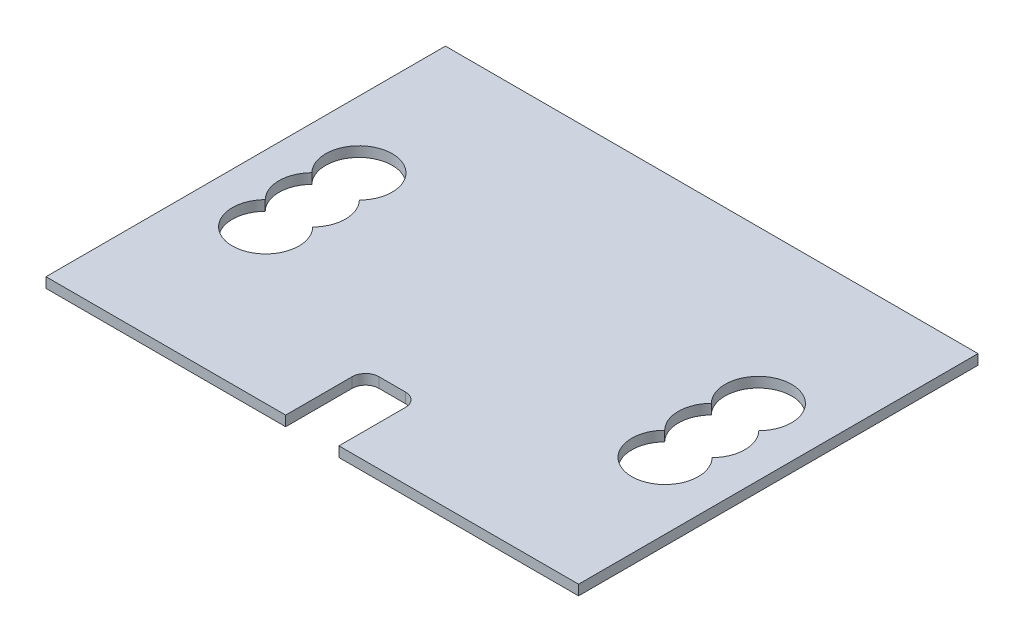
ISO-10303-21;
HEADER;
FILE_DESCRIPTION(('STEP AP214'),'2;1');
FILE_NAME('part.step','',(''),(''),'','','');
FILE_SCHEMA(('AUTOMOTIVE_DESIGN { 1 0 10303 214 1 1 1 1 }'));
ENDSEC;
DATA;
#1=APPLICATION_CONTEXT('core data for automotive mechanical design processes');
#2=APPLICATION_PROTOCOL_DEFINITION('international standard','automotive_design',2000,#1);
#3=PRODUCT_CONTEXT('',#1,'mechanical');
#4=PRODUCT('Part','Part','',(#3));
#5=PRODUCT_RELATED_PRODUCT_CATEGORY('part','',(#4));
#6=PRODUCT_DEFINITION_FORMATION('','',#4);
#7=PRODUCT_DEFINITION_CONTEXT('part definition',#1,'design');
#8=PRODUCT_DEFINITION('design','',#6,#7);
#9=PRODUCT_DEFINITION_SHAPE('','',#8);
#10=(LENGTH_UNIT() NAMED_UNIT(*) SI_UNIT(.MILLI.,.METRE.));
#11=(NAMED_UNIT(*) PLANE_ANGLE_UNIT() SI_UNIT($,.RADIAN.));
#12=(NAMED_UNIT(*) SI_UNIT($,.STERADIAN.) SOLID_ANGLE_UNIT());
#13=UNCERTAINTY_MEASURE_WITH_UNIT(LENGTH_MEASURE(1.E-05),#10,'distance_accuracy_value','');
#14=(GEOMETRIC_REPRESENTATION_CONTEXT(3) GLOBAL_UNCERTAINTY_ASSIGNED_CONTEXT((#13)) GLOBAL_UNIT_ASSIGNED_CONTEXT((#10,
#11,#12)) REPRESENTATION_CONTEXT('',''));
#15=CARTESIAN_POINT('',(0.,0.,0.));
#16=DIRECTION('',(0.,0.,1.));
#17=DIRECTION('',(1.,0.,0.));
#18=AXIS2_PLACEMENT_3D('',#15,#16,#17);
#19=CARTESIAN_POINT('',(0.,7.62,0.));
#20=DIRECTION('',(0.,0.,-1.));
#21=DIRECTION('',(-1.,0.,0.));
#22=AXIS2_PLACEMENT_3D('',#19,#20,#21);
#23=PLANE('',#22);
#24=DIRECTION('',(1.,0.,0.));
#25=VECTOR('',#24,1.);
#26=CARTESIAN_POINT('',(0.,0.,0.));
#27=LINE('',#26,#25);
#28=CARTESIAN_POINT('',(0.,0.,0.));
#29=VERTEX_POINT('',#28);
#30=CARTESIAN_POINT('',(180.,0.,0.));
#31=VERTEX_POINT('',#30);
#32=EDGE_CURVE('E175',#29,#31,#27,.T.);
#33=ORIENTED_EDGE('',*,*,#32,.T.);
#34=DIRECTION('',(0.,1.,0.));
#35=VECTOR('',#34,1.);
#36=CARTESIAN_POINT('',(180.,0.,0.));
#37=LINE('',#36,#35);
#38=CARTESIAN_POINT('',(180.,7.62,0.));
#39=VERTEX_POINT('',#38);
#40=EDGE_CURVE('E158',#31,#39,#37,.T.);
#41=ORIENTED_EDGE('',*,*,#40,.T.);
#42=DIRECTION('',(1.,0.,0.));
#43=VECTOR('',#42,1.);
#44=CARTESIAN_POINT('',(0.,7.62,0.));
#45=LINE('',#44,#43);
#46=CARTESIAN_POINT('',(0.,7.62,0.));
#47=VERTEX_POINT('',#46);
#48=EDGE_CURVE('E223',#47,#39,#45,.T.);
#49=ORIENTED_EDGE('',*,*,#48,.F.);
#50=DIRECTION('',(0.,-1.,0.));
#51=VECTOR('',#50,1.);
#52=CARTESIAN_POINT('',(0.,7.62,0.));
#53=LINE('',#52,#51);
#54=EDGE_CURVE('E11',#47,#29,#53,.T.);
#55=ORIENTED_EDGE('',*,*,#54,.T.);
#56=EDGE_LOOP('',(#33,#41,#49,#55));
#57=FACE_BOUND('',#56,.T.);
#58=ADVANCED_FACE('F33',(#57),#23,.F.);
#59=CARTESIAN_POINT('',(0.,7.62,0.));
#60=DIRECTION('',(1.,0.,0.));
#61=DIRECTION('',(0.,0.,-1.));
#62=AXIS2_PLACEMENT_3D('',#59,#60,#61);
#63=PLANE('',#62);
#64=DIRECTION('',(0.,0.,1.));
#65=VECTOR('',#64,1.);
#66=CARTESIAN_POINT('',(0.,0.,0.));
#67=LINE('',#66,#65);
#68=CARTESIAN_POINT('',(0.,0.,-300.));
#69=VERTEX_POINT('',#68);
#70=EDGE_CURVE('E188',#69,#29,#67,.T.);
#71=ORIENTED_EDGE('',*,*,#70,.T.);
#72=ORIENTED_EDGE('',*,*,#54,.F.);
#73=DIRECTION('',(0.,0.,1.));
#74=VECTOR('',#73,1.);
#75=CARTESIAN_POINT('',(0.,7.62,0.));
#76=LINE('',#75,#74);
#77=CARTESIAN_POINT('',(0.,7.62,-300.));
#78=VERTEX_POINT('',#77);
#79=EDGE_CURVE('E193',#78,#47,#76,.T.);
#80=ORIENTED_EDGE('',*,*,#79,.F.);
#81=DIRECTION('',(0.,-1.,0.));
#82=VECTOR('',#81,1.);
#83=CARTESIAN_POINT('',(0.,7.62,-300.));
#84=LINE('',#83,#82);
#85=EDGE_CURVE('E194',#78,#69,#84,.T.);
#86=ORIENTED_EDGE('',*,*,#85,.T.);
#87=EDGE_LOOP('',(#71,#72,#80,#86));
#88=FACE_BOUND('',#87,.T.);
#89=ADVANCED_FACE('F35',(#88),#63,.F.);
#90=CARTESIAN_POINT('',(220.,7.62,0.));
#91=VERTEX_POINT('',#90);
#92=CARTESIAN_POINT('',(400.,7.62,0.));
#93=VERTEX_POINT('',#92);
#94=EDGE_CURVE('E221',#91,#93,#45,.T.);
#95=ORIENTED_EDGE('',*,*,#94,.F.);
#96=DIRECTION('',(0.,1.,0.));
#97=VECTOR('',#96,1.);
#98=CARTESIAN_POINT('',(220.,0.,0.));
#99=LINE('',#98,#97);
#100=CARTESIAN_POINT('',(220.,0.,0.));
#101=VERTEX_POINT('',#100);
#102=EDGE_CURVE('E168',#101,#91,#99,.T.);
#103=ORIENTED_EDGE('',*,*,#102,.F.);
#104=CARTESIAN_POINT('',(400.,0.,0.));
#105=VERTEX_POINT('',#104);
#106=EDGE_CURVE('E184',#101,#105,#27,.T.);
#107=ORIENTED_EDGE('',*,*,#106,.T.);
#108=DIRECTION('',(0.,-1.,0.));
#109=VECTOR('',#108,1.);
#110=CARTESIAN_POINT('',(400.,7.62,0.));
#111=LINE('',#110,#109);
#112=EDGE_CURVE('E41',#93,#105,#111,.T.);
#113=ORIENTED_EDGE('',*,*,#112,.F.);
#114=EDGE_LOOP('',(#95,#103,#107,#113));
#115=FACE_BOUND('',#114,.T.);
#116=ADVANCED_FACE('F235',(#115),#23,.F.);
#117=CARTESIAN_POINT('',(400.,7.62,0.));
#118=DIRECTION('',(-1.,0.,0.));
#119=DIRECTION('',(0.,0.,1.));
#120=AXIS2_PLACEMENT_3D('',#117,#118,#119);
#121=PLANE('',#120);
#122=DIRECTION('',(0.,0.,-1.));
#123=VECTOR('',#122,1.);
#124=CARTESIAN_POINT('',(400.,0.,0.));
#125=LINE('',#124,#123);
#126=CARTESIAN_POINT('',(400.,0.,-300.));
#127=VERTEX_POINT('',#126);
#128=EDGE_CURVE('E183',#105,#127,#125,.T.);
#129=ORIENTED_EDGE('',*,*,#128,.T.);
#130=DIRECTION('',(0.,-1.,0.));
#131=VECTOR('',#130,1.);
#132=CARTESIAN_POINT('',(400.,7.62,-300.));
#133=LINE('',#132,#131);
#134=CARTESIAN_POINT('',(400.,7.62,-300.));
#135=VERTEX_POINT('',#134);
#136=EDGE_CURVE('E197',#135,#127,#133,.T.);
#137=ORIENTED_EDGE('',*,*,#136,.F.);
#138=DIRECTION('',(0.,0.,-1.));
#139=VECTOR('',#138,1.);
#140=CARTESIAN_POINT('',(400.,7.62,0.));
#141=LINE('',#140,#139);
#142=EDGE_CURVE('E207',#93,#135,#141,.T.);
#143=ORIENTED_EDGE('',*,*,#142,.F.);
#144=ORIENTED_EDGE('',*,*,#112,.T.);
#145=EDGE_LOOP('',(#129,#137,#143,#144));
#146=FACE_BOUND('',#145,.T.);
#147=ADVANCED_FACE('F205',(#146),#121,.F.);
#148=CARTESIAN_POINT('',(0.,7.62,-300.));
#149=DIRECTION('',(0.,0.,1.));
#150=DIRECTION('',(1.,0.,0.));
#151=AXIS2_PLACEMENT_3D('',#148,#149,#150);
#152=PLANE('',#151);
#153=DIRECTION('',(-1.,0.,0.));
#154=VECTOR('',#153,1.);
#155=CARTESIAN_POINT('',(0.,0.,-300.));
#156=LINE('',#155,#154);
#157=EDGE_CURVE('E186',#127,#69,#156,.T.);
#158=ORIENTED_EDGE('',*,*,#157,.T.);
#159=ORIENTED_EDGE('',*,*,#85,.F.);
#160=DIRECTION('',(-1.,0.,0.));
#161=VECTOR('',#160,1.);
#162=CARTESIAN_POINT('',(0.,7.62,-300.));
#163=LINE('',#162,#161);
#164=EDGE_CURVE('E198',#135,#78,#163,.T.);
#165=ORIENTED_EDGE('',*,*,#164,.F.);
#166=ORIENTED_EDGE('',*,*,#136,.T.);
#167=EDGE_LOOP('',(#158,#159,#165,#166));
#168=FACE_BOUND('',#167,.T.);
#169=ADVANCED_FACE('F215',(#168),#152,.F.);
#170=CARTESIAN_POINT('',(0.,7.62,0.));
#171=DIRECTION('',(0.,-1.,0.));
#172=DIRECTION('',(0.,0.,-1.));
#173=AXIS2_PLACEMENT_3D('',#170,#171,#172);
#174=PLANE('',#173);
#175=CARTESIAN_POINT('',(50.,7.62,-150.));
#176=DIRECTION('',(0.,1.,0.));
#177=DIRECTION('',(0.,0.,1.));
#178=AXIS2_PLACEMENT_3D('',#175,#176,#177);
#179=CIRCLE('',#178,25.);
#180=CARTESIAN_POINT('',(67.8280487995744,7.62,-132.474));
#181=VERTEX_POINT('',#180);
#182=CARTESIAN_POINT('',(67.8280487995742,7.62,-167.526));
#183=VERTEX_POINT('',#182);
#184=EDGE_CURVE('E258',#181,#183,#179,.T.);
#185=ORIENTED_EDGE('',*,*,#184,.F.);
#186=CARTESIAN_POINT('',(50.0000000000004,7.62,-114.948));
#187=DIRECTION('',(0.,1.,0.));
#188=DIRECTION('',(0.,0.,1.));
#189=AXIS2_PLACEMENT_3D('',#186,#187,#188);
#190=CIRCLE('',#189,25.);
#191=CARTESIAN_POINT('',(32.171951200426,7.62,-132.474));
#192=VERTEX_POINT('',#191);
#193=EDGE_CURVE('E56',#192,#181,#190,.T.);
#194=ORIENTED_EDGE('',*,*,#193,.F.);
#195=CARTESIAN_POINT('',(50.,7.62,-150.));
#196=DIRECTION('',(0.,1.,0.));
#197=DIRECTION('',(0.,0.,1.));
#198=AXIS2_PLACEMENT_3D('',#195,#196,#197);
#199=CIRCLE('',#198,25.);
#200=CARTESIAN_POINT('',(32.1719512004257,7.62,-167.526));
#201=VERTEX_POINT('',#200);
#202=EDGE_CURVE('E247',#201,#192,#199,.T.);
#203=ORIENTED_EDGE('',*,*,#202,.F.);
#204=CARTESIAN_POINT('',(49.9999999999999,7.62,-185.052));
#205=DIRECTION('',(0.,1.,0.));
#206=DIRECTION('',(0.,0.,1.));
#207=AXIS2_PLACEMENT_3D('',#204,#205,#206);
#208=CIRCLE('',#207,25.);
#209=EDGE_CURVE('E262',#183,#201,#208,.T.);
#210=ORIENTED_EDGE('',*,*,#209,.F.);
#211=EDGE_LOOP('',(#185,#194,#203,#210));
#212=FACE_BOUND('',#211,.T.);
#213=CARTESIAN_POINT('',(350.,7.62,-150.));
#214=DIRECTION('',(0.,1.,0.));
#215=DIRECTION('',(0.,0.,-1.));
#216=AXIS2_PLACEMENT_3D('',#213,#214,#215);
#217=CIRCLE('',#216,25.);
#218=CARTESIAN_POINT('',(332.171951200426,7.62,-167.526));
#219=VERTEX_POINT('',#218);
#220=CARTESIAN_POINT('',(332.171951200426,7.62,-132.474));
#221=VERTEX_POINT('',#220);
#222=EDGE_CURVE('E289',#219,#221,#217,.T.);
#223=ORIENTED_EDGE('',*,*,#222,.F.);
#224=CARTESIAN_POINT('',(350.,7.62,-185.052));
#225=DIRECTION('',(0.,1.,0.));
#226=DIRECTION('',(0.,0.,-1.));
#227=AXIS2_PLACEMENT_3D('',#224,#225,#226);
#228=CIRCLE('',#227,25.);
#229=CARTESIAN_POINT('',(367.828048799574,7.62,-167.526));
#230=VERTEX_POINT('',#229);
#231=EDGE_CURVE('E287',#230,#219,#228,.T.);
#232=ORIENTED_EDGE('',*,*,#231,.F.);
#233=CARTESIAN_POINT('',(350.,7.62,-150.));
#234=DIRECTION('',(0.,1.,0.));
#235=DIRECTION('',(0.,0.,-1.));
#236=AXIS2_PLACEMENT_3D('',#233,#234,#235);
#237=CIRCLE('',#236,25.);
#238=CARTESIAN_POINT('',(367.828048799574,7.62,-132.474));
#239=VERTEX_POINT('',#238);
#240=EDGE_CURVE('E278',#239,#230,#237,.T.);
#241=ORIENTED_EDGE('',*,*,#240,.F.);
#242=CARTESIAN_POINT('',(350.,7.62,-114.948));
#243=DIRECTION('',(0.,1.,0.));
#244=DIRECTION('',(0.,0.,-1.));
#245=AXIS2_PLACEMENT_3D('',#242,#243,#244);
#246=CIRCLE('',#245,25.);
#247=EDGE_CURVE('E293',#221,#239,#246,.T.);
#248=ORIENTED_EDGE('',*,*,#247,.F.);
#249=EDGE_LOOP('',(#223,#232,#241,#248));
#250=FACE_BOUND('',#249,.T.);
#251=ORIENTED_EDGE('',*,*,#48,.T.);
#252=DIRECTION('',(0.,0.,1.));
#253=VECTOR('',#252,1.);
#254=CARTESIAN_POINT('',(180.,7.62,0.));
#255=LINE('',#254,#253);
#256=CARTESIAN_POINT('',(180.,7.62,-49.9999999999999));
#257=VERTEX_POINT('',#256);
#258=EDGE_CURVE('E164',#257,#39,#255,.T.);
#259=ORIENTED_EDGE('',*,*,#258,.F.);
#260=CARTESIAN_POINT('',(190.,7.62,-50.));
#261=DIRECTION('',(0.,1.,0.));
#262=DIRECTION('',(0.,0.,-1.));
#263=AXIS2_PLACEMENT_3D('',#260,#261,#262);
#264=CIRCLE('',#263,10.);
#265=CARTESIAN_POINT('',(190.,7.62,-60.));
#266=VERTEX_POINT('',#265);
#267=EDGE_CURVE('E179',#266,#257,#264,.T.);
#268=ORIENTED_EDGE('',*,*,#267,.F.);
#269=DIRECTION('',(-1.,0.,0.));
#270=VECTOR('',#269,1.);
#271=CARTESIAN_POINT('',(190.,7.62,-60.));
#272=LINE('',#271,#270);
#273=CARTESIAN_POINT('',(210.,7.62,-60.));
#274=VERTEX_POINT('',#273);
#275=EDGE_CURVE('E474',#274,#266,#272,.T.);
#276=ORIENTED_EDGE('',*,*,#275,.F.);
#277=CARTESIAN_POINT('',(210.,7.62,-50.));
#278=DIRECTION('',(0.,1.,0.));
#279=DIRECTION('',(0.,0.,-1.));
#280=AXIS2_PLACEMENT_3D('',#277,#278,#279);
#281=CIRCLE('',#280,10.);
#282=CARTESIAN_POINT('',(220.,7.62,-49.9999999999999));
#283=VERTEX_POINT('',#282);
#284=EDGE_CURVE('E468',#283,#274,#281,.T.);
#285=ORIENTED_EDGE('',*,*,#284,.F.);
#286=DIRECTION('',(0.,0.,-1.));
#287=VECTOR('',#286,1.);
#288=CARTESIAN_POINT('',(220.,7.62,0.));
#289=LINE('',#288,#287);
#290=EDGE_CURVE('E233',#91,#283,#289,.T.);
#291=ORIENTED_EDGE('',*,*,#290,.F.);
#292=ORIENTED_EDGE('',*,*,#94,.T.);
#293=ORIENTED_EDGE('',*,*,#142,.T.);
#294=ORIENTED_EDGE('',*,*,#164,.T.);
#295=ORIENTED_EDGE('',*,*,#79,.T.);
#296=EDGE_LOOP('',(#251,#259,#268,#276,#285,#291,#292,#293,#294,#295));
#297=FACE_BOUND('',#296,.T.);
#298=ADVANCED_FACE('F229',(#212,#250,#297),#174,.F.);
#299=CARTESIAN_POINT('',(0.,0.,0.));
#300=DIRECTION('',(0.,-1.,0.));
#301=DIRECTION('',(0.,0.,-1.));
#302=AXIS2_PLACEMENT_3D('',#299,#300,#301);
#303=PLANE('',#302);
#304=DIRECTION('',(0.,0.,1.));
#305=VECTOR('',#304,1.);
#306=CARTESIAN_POINT('',(180.,0.,0.));
#307=LINE('',#306,#305);
#308=CARTESIAN_POINT('',(180.,0.,-49.9999999999999));
#309=VERTEX_POINT('',#308);
#310=EDGE_CURVE('E161',#309,#31,#307,.T.);
#311=ORIENTED_EDGE('',*,*,#310,.T.);
#312=ORIENTED_EDGE('',*,*,#32,.F.);
#313=ORIENTED_EDGE('',*,*,#70,.F.);
#314=ORIENTED_EDGE('',*,*,#157,.F.);
#315=ORIENTED_EDGE('',*,*,#128,.F.);
#316=ORIENTED_EDGE('',*,*,#106,.F.);
#317=DIRECTION('',(0.,0.,-1.));
#318=VECTOR('',#317,1.);
#319=CARTESIAN_POINT('',(220.,0.,0.));
#320=LINE('',#319,#318);
#321=CARTESIAN_POINT('',(220.,0.,-49.9999999999999));
#322=VERTEX_POINT('',#321);
#323=EDGE_CURVE('E178',#101,#322,#320,.T.);
#324=ORIENTED_EDGE('',*,*,#323,.T.);
#325=CARTESIAN_POINT('',(210.,0.,-50.));
#326=DIRECTION('',(0.,1.,0.));
#327=DIRECTION('',(0.,0.,-1.));
#328=AXIS2_PLACEMENT_3D('',#325,#326,#327);
#329=CIRCLE('',#328,10.);
#330=CARTESIAN_POINT('',(210.,0.,-60.));
#331=VERTEX_POINT('',#330);
#332=EDGE_CURVE('E48',#322,#331,#329,.T.);
#333=ORIENTED_EDGE('',*,*,#332,.T.);
#334=DIRECTION('',(-1.,0.,0.));
#335=VECTOR('',#334,1.);
#336=CARTESIAN_POINT('',(190.,0.,-60.));
#337=LINE('',#336,#335);
#338=CARTESIAN_POINT('',(190.,0.,-60.));
#339=VERTEX_POINT('',#338);
#340=EDGE_CURVE('E484',#331,#339,#337,.T.);
#341=ORIENTED_EDGE('',*,*,#340,.T.);
#342=CARTESIAN_POINT('',(190.,0.,-50.));
#343=DIRECTION('',(0.,1.,0.));
#344=DIRECTION('',(0.,0.,-1.));
#345=AXIS2_PLACEMENT_3D('',#342,#343,#344);
#346=CIRCLE('',#345,10.);
#347=EDGE_CURVE('E169',#339,#309,#346,.T.);
#348=ORIENTED_EDGE('',*,*,#347,.T.);
#349=EDGE_LOOP('',(#311,#312,#313,#314,#315,#316,#324,#333,#341,#348));
#350=FACE_BOUND('',#349,.T.);
#351=CARTESIAN_POINT('',(50.0000000000004,0.,-114.948));
#352=DIRECTION('',(0.,1.,0.));
#353=DIRECTION('',(0.,0.,1.));
#354=AXIS2_PLACEMENT_3D('',#351,#352,#353);
#355=CIRCLE('',#354,25.);
#356=CARTESIAN_POINT('',(32.171951200426,0.,-132.474));
#357=VERTEX_POINT('',#356);
#358=CARTESIAN_POINT('',(67.8280487995744,0.,-132.474));
#359=VERTEX_POINT('',#358);
#360=EDGE_CURVE('E243',#357,#359,#355,.T.);
#361=ORIENTED_EDGE('',*,*,#360,.T.);
#362=CARTESIAN_POINT('',(50.,0.,-150.));
#363=DIRECTION('',(0.,1.,0.));
#364=DIRECTION('',(0.,0.,1.));
#365=AXIS2_PLACEMENT_3D('',#362,#363,#364);
#366=CIRCLE('',#365,25.);
#367=CARTESIAN_POINT('',(67.8280487995742,0.,-167.526));
#368=VERTEX_POINT('',#367);
#369=EDGE_CURVE('E246',#359,#368,#366,.T.);
#370=ORIENTED_EDGE('',*,*,#369,.T.);
#371=CARTESIAN_POINT('',(49.9999999999999,0.,-185.052));
#372=DIRECTION('',(0.,1.,0.));
#373=DIRECTION('',(0.,0.,1.));
#374=AXIS2_PLACEMENT_3D('',#371,#372,#373);
#375=CIRCLE('',#374,25.);
#376=CARTESIAN_POINT('',(32.1719512004257,0.,-167.526));
#377=VERTEX_POINT('',#376);
#378=EDGE_CURVE('E250',#368,#377,#375,.T.);
#379=ORIENTED_EDGE('',*,*,#378,.T.);
#380=CARTESIAN_POINT('',(50.,0.,-150.));
#381=DIRECTION('',(0.,1.,0.));
#382=DIRECTION('',(0.,0.,1.));
#383=AXIS2_PLACEMENT_3D('',#380,#381,#382);
#384=CIRCLE('',#383,25.);
#385=EDGE_CURVE('E253',#377,#357,#384,.T.);
#386=ORIENTED_EDGE('',*,*,#385,.T.);
#387=EDGE_LOOP('',(#361,#370,#379,#386));
#388=FACE_BOUND('',#387,.T.);
#389=CARTESIAN_POINT('',(350.,0.,-185.052));
#390=DIRECTION('',(0.,1.,0.));
#391=DIRECTION('',(0.,0.,-1.));
#392=AXIS2_PLACEMENT_3D('',#389,#390,#391);
#393=CIRCLE('',#392,25.);
#394=CARTESIAN_POINT('',(367.828048799574,0.,-167.526));
#395=VERTEX_POINT('',#394);
#396=CARTESIAN_POINT('',(332.171951200426,0.,-167.526));
#397=VERTEX_POINT('',#396);
#398=EDGE_CURVE('E274',#395,#397,#393,.T.);
#399=ORIENTED_EDGE('',*,*,#398,.T.);
#400=CARTESIAN_POINT('',(350.,0.,-150.));
#401=DIRECTION('',(0.,1.,0.));
#402=DIRECTION('',(0.,0.,-1.));
#403=AXIS2_PLACEMENT_3D('',#400,#401,#402);
#404=CIRCLE('',#403,25.);
#405=CARTESIAN_POINT('',(332.171951200426,0.,-132.474));
#406=VERTEX_POINT('',#405);
#407=EDGE_CURVE('E277',#397,#406,#404,.T.);
#408=ORIENTED_EDGE('',*,*,#407,.T.);
#409=CARTESIAN_POINT('',(350.,0.,-114.948));
#410=DIRECTION('',(0.,1.,0.));
#411=DIRECTION('',(0.,0.,-1.));
#412=AXIS2_PLACEMENT_3D('',#409,#410,#411);
#413=CIRCLE('',#412,25.);
#414=CARTESIAN_POINT('',(367.828048799574,0.,-132.474));
#415=VERTEX_POINT('',#414);
#416=EDGE_CURVE('E281',#406,#415,#413,.T.);
#417=ORIENTED_EDGE('',*,*,#416,.T.);
#418=CARTESIAN_POINT('',(350.,0.,-150.));
#419=DIRECTION('',(0.,1.,0.));
#420=DIRECTION('',(0.,0.,-1.));
#421=AXIS2_PLACEMENT_3D('',#418,#419,#420);
#422=CIRCLE('',#421,25.);
#423=EDGE_CURVE('E284',#415,#395,#422,.T.);
#424=ORIENTED_EDGE('',*,*,#423,.T.);
#425=EDGE_LOOP('',(#399,#408,#417,#424));
#426=FACE_BOUND('',#425,.T.);
#427=ADVANCED_FACE('F172',(#350,#388,#426),#303,.T.);
#428=CARTESIAN_POINT('',(350.,0.,-185.052));
#429=DIRECTION('',(0.,1.,0.));
#430=DIRECTION('',(0.,0.,1.));
#431=AXIS2_PLACEMENT_3D('',#428,#429,#430);
#432=CYLINDRICAL_SURFACE('',#431,25.);
#433=ORIENTED_EDGE('',*,*,#231,.T.);
#434=DIRECTION('',(0.,1.,0.));
#435=VECTOR('',#434,1.);
#436=CARTESIAN_POINT('',(332.171951200426,0.,-167.526));
#437=LINE('',#436,#435);
#438=EDGE_CURVE('E226',#397,#219,#437,.T.);
#439=ORIENTED_EDGE('',*,*,#438,.F.);
#440=ORIENTED_EDGE('',*,*,#398,.F.);
#441=DIRECTION('',(0.,1.,0.));
#442=VECTOR('',#441,1.);
#443=CARTESIAN_POINT('',(367.828048799574,0.,-167.526));
#444=LINE('',#443,#442);
#445=EDGE_CURVE('E259',#395,#230,#444,.T.);
#446=ORIENTED_EDGE('',*,*,#445,.T.);
#447=EDGE_LOOP('',(#433,#439,#440,#446));
#448=FACE_BOUND('',#447,.T.);
#449=ADVANCED_FACE('F319',(#448),#432,.F.);
#450=CARTESIAN_POINT('',(350.,0.,-150.));
#451=DIRECTION('',(0.,1.,0.));
#452=DIRECTION('',(0.,0.,1.));
#453=AXIS2_PLACEMENT_3D('',#450,#451,#452);
#454=CYLINDRICAL_SURFACE('',#453,25.);
#455=ORIENTED_EDGE('',*,*,#240,.T.);
#456=ORIENTED_EDGE('',*,*,#445,.F.);
#457=ORIENTED_EDGE('',*,*,#423,.F.);
#458=DIRECTION('',(0.,1.,0.));
#459=VECTOR('',#458,1.);
#460=CARTESIAN_POINT('',(367.828048799574,0.,-132.474));
#461=LINE('',#460,#459);
#462=EDGE_CURVE('E299',#415,#239,#461,.T.);
#463=ORIENTED_EDGE('',*,*,#462,.T.);
#464=EDGE_LOOP('',(#455,#456,#457,#463));
#465=FACE_BOUND('',#464,.T.);
#466=ADVANCED_FACE('F317',(#465),#454,.F.);
#467=CARTESIAN_POINT('',(350.,0.,-114.948));
#468=DIRECTION('',(0.,1.,0.));
#469=DIRECTION('',(0.,0.,1.));
#470=AXIS2_PLACEMENT_3D('',#467,#468,#469);
#471=CYLINDRICAL_SURFACE('',#470,25.);
#472=ORIENTED_EDGE('',*,*,#247,.T.);
#473=ORIENTED_EDGE('',*,*,#462,.F.);
#474=ORIENTED_EDGE('',*,*,#416,.F.);
#475=DIRECTION('',(0.,1.,0.));
#476=VECTOR('',#475,1.);
#477=CARTESIAN_POINT('',(332.171951200426,0.,-132.474));
#478=LINE('',#477,#476);
#479=EDGE_CURVE('E300',#406,#221,#478,.T.);
#480=ORIENTED_EDGE('',*,*,#479,.T.);
#481=EDGE_LOOP('',(#472,#473,#474,#480));
#482=FACE_BOUND('',#481,.T.);
#483=ADVANCED_FACE('F314',(#482),#471,.F.);
#484=CARTESIAN_POINT('',(350.,0.,-150.));
#485=DIRECTION('',(0.,1.,0.));
#486=DIRECTION('',(0.,0.,1.));
#487=AXIS2_PLACEMENT_3D('',#484,#485,#486);
#488=CYLINDRICAL_SURFACE('',#487,25.);
#489=ORIENTED_EDGE('',*,*,#222,.T.);
#490=ORIENTED_EDGE('',*,*,#479,.F.);
#491=ORIENTED_EDGE('',*,*,#407,.F.);
#492=ORIENTED_EDGE('',*,*,#438,.T.);
#493=EDGE_LOOP('',(#489,#490,#491,#492));
#494=FACE_BOUND('',#493,.T.);
#495=ADVANCED_FACE('F307',(#494),#488,.F.);
#496=CARTESIAN_POINT('',(50.0000000000004,0.,-114.948));
#497=DIRECTION('',(0.,1.,0.));
#498=DIRECTION('',(0.,0.,1.));
#499=AXIS2_PLACEMENT_3D('',#496,#497,#498);
#500=CYLINDRICAL_SURFACE('',#499,25.);
#501=ORIENTED_EDGE('',*,*,#193,.T.);
#502=DIRECTION('',(0.,1.,0.));
#503=VECTOR('',#502,1.);
#504=CARTESIAN_POINT('',(67.8280487995744,0.,-132.474));
#505=LINE('',#504,#503);
#506=EDGE_CURVE('E256',#359,#181,#505,.T.);
#507=ORIENTED_EDGE('',*,*,#506,.F.);
#508=ORIENTED_EDGE('',*,*,#360,.F.);
#509=DIRECTION('',(0.,1.,0.));
#510=VECTOR('',#509,1.);
#511=CARTESIAN_POINT('',(32.171951200426,0.,-132.474));
#512=LINE('',#511,#510);
#513=EDGE_CURVE('E267',#357,#192,#512,.T.);
#514=ORIENTED_EDGE('',*,*,#513,.T.);
#515=EDGE_LOOP('',(#501,#507,#508,#514));
#516=FACE_BOUND('',#515,.T.);
#517=ADVANCED_FACE('F355',(#516),#500,.F.);
#518=CARTESIAN_POINT('',(50.,0.,-150.));
#519=DIRECTION('',(0.,1.,0.));
#520=DIRECTION('',(0.,0.,1.));
#521=AXIS2_PLACEMENT_3D('',#518,#519,#520);
#522=CYLINDRICAL_SURFACE('',#521,25.);
#523=ORIENTED_EDGE('',*,*,#202,.T.);
#524=ORIENTED_EDGE('',*,*,#513,.F.);
#525=ORIENTED_EDGE('',*,*,#385,.F.);
#526=DIRECTION('',(0.,1.,0.));
#527=VECTOR('',#526,1.);
#528=CARTESIAN_POINT('',(32.1719512004257,0.,-167.526));
#529=LINE('',#528,#527);
#530=EDGE_CURVE('E269',#377,#201,#529,.T.);
#531=ORIENTED_EDGE('',*,*,#530,.T.);
#532=EDGE_LOOP('',(#523,#524,#525,#531));
#533=FACE_BOUND('',#532,.T.);
#534=ADVANCED_FACE('F358',(#533),#522,.F.);
#535=CARTESIAN_POINT('',(49.9999999999999,0.,-185.052));
#536=DIRECTION('',(0.,1.,0.));
#537=DIRECTION('',(0.,0.,1.));
#538=AXIS2_PLACEMENT_3D('',#535,#536,#537);
#539=CYLINDRICAL_SURFACE('',#538,25.);
#540=ORIENTED_EDGE('',*,*,#209,.T.);
#541=ORIENTED_EDGE('',*,*,#530,.F.);
#542=ORIENTED_EDGE('',*,*,#378,.F.);
#543=DIRECTION('',(0.,1.,0.));
#544=VECTOR('',#543,1.);
#545=CARTESIAN_POINT('',(67.8280487995742,0.,-167.526));
#546=LINE('',#545,#544);
#547=EDGE_CURVE('E271',#368,#183,#546,.T.);
#548=ORIENTED_EDGE('',*,*,#547,.T.);
#549=EDGE_LOOP('',(#540,#541,#542,#548));
#550=FACE_BOUND('',#549,.T.);
#551=ADVANCED_FACE('F360',(#550),#539,.F.);
#552=CARTESIAN_POINT('',(50.,0.,-150.));
#553=DIRECTION('',(0.,1.,0.));
#554=DIRECTION('',(0.,0.,1.));
#555=AXIS2_PLACEMENT_3D('',#552,#553,#554);
#556=CYLINDRICAL_SURFACE('',#555,25.);
#557=ORIENTED_EDGE('',*,*,#184,.T.);
#558=ORIENTED_EDGE('',*,*,#547,.F.);
#559=ORIENTED_EDGE('',*,*,#369,.F.);
#560=ORIENTED_EDGE('',*,*,#506,.T.);
#561=EDGE_LOOP('',(#557,#558,#559,#560));
#562=FACE_BOUND('',#561,.T.);
#563=ADVANCED_FACE('F352',(#562),#556,.F.);
#564=CARTESIAN_POINT('',(180.,0.,0.));
#565=DIRECTION('',(-1.,0.,0.));
#566=DIRECTION('',(0.,0.,1.));
#567=AXIS2_PLACEMENT_3D('',#564,#565,#566);
#568=PLANE('',#567);
#569=ORIENTED_EDGE('',*,*,#258,.T.);
#570=ORIENTED_EDGE('',*,*,#40,.F.);
#571=ORIENTED_EDGE('',*,*,#310,.F.);
#572=DIRECTION('',(0.,1.,0.));
#573=VECTOR('',#572,1.);
#574=CARTESIAN_POINT('',(180.,0.,-49.9999999999999));
#575=LINE('',#574,#573);
#576=EDGE_CURVE('E290',#309,#257,#575,.T.);
#577=ORIENTED_EDGE('',*,*,#576,.T.);
#578=EDGE_LOOP('',(#569,#570,#571,#577));
#579=FACE_BOUND('',#578,.T.);
#580=ADVANCED_FACE('F160',(#579),#568,.F.);
#581=CARTESIAN_POINT('',(190.,0.,-50.));
#582=DIRECTION('',(0.,1.,0.));
#583=DIRECTION('',(0.,0.,1.));
#584=AXIS2_PLACEMENT_3D('',#581,#582,#583);
#585=CYLINDRICAL_SURFACE('',#584,10.);
#586=ORIENTED_EDGE('',*,*,#267,.T.);
#587=ORIENTED_EDGE('',*,*,#576,.F.);
#588=ORIENTED_EDGE('',*,*,#347,.F.);
#589=DIRECTION('',(0.,1.,0.));
#590=VECTOR('',#589,1.);
#591=CARTESIAN_POINT('',(190.,0.,-60.));
#592=LINE('',#591,#590);
#593=EDGE_CURVE('E482',#339,#266,#592,.T.);
#594=ORIENTED_EDGE('',*,*,#593,.T.);
#595=EDGE_LOOP('',(#586,#587,#588,#594));
#596=FACE_BOUND('',#595,.T.);
#597=ADVANCED_FACE('F428',(#596),#585,.F.);
#598=CARTESIAN_POINT('',(190.,0.,-60.));
#599=DIRECTION('',(0.,0.,-1.));
#600=DIRECTION('',(-1.,0.,0.));
#601=AXIS2_PLACEMENT_3D('',#598,#599,#600);
#602=PLANE('',#601);
#603=ORIENTED_EDGE('',*,*,#275,.T.);
#604=ORIENTED_EDGE('',*,*,#593,.F.);
#605=ORIENTED_EDGE('',*,*,#340,.F.);
#606=DIRECTION('',(0.,1.,0.));
#607=VECTOR('',#606,1.);
#608=CARTESIAN_POINT('',(210.,0.,-60.));
#609=LINE('',#608,#607);
#610=EDGE_CURVE('E239',#331,#274,#609,.T.);
#611=ORIENTED_EDGE('',*,*,#610,.T.);
#612=EDGE_LOOP('',(#603,#604,#605,#611));
#613=FACE_BOUND('',#612,.T.);
#614=ADVANCED_FACE('F436',(#613),#602,.F.);
#615=CARTESIAN_POINT('',(210.,0.,-50.));
#616=DIRECTION('',(0.,1.,0.));
#617=DIRECTION('',(0.,0.,1.));
#618=AXIS2_PLACEMENT_3D('',#615,#616,#617);
#619=CYLINDRICAL_SURFACE('',#618,10.);
#620=ORIENTED_EDGE('',*,*,#284,.T.);
#621=ORIENTED_EDGE('',*,*,#610,.F.);
#622=ORIENTED_EDGE('',*,*,#332,.F.);
#623=DIRECTION('',(0.,1.,0.));
#624=VECTOR('',#623,1.);
#625=CARTESIAN_POINT('',(220.,0.,-49.9999999999999));
#626=LINE('',#625,#624);
#627=EDGE_CURVE('E237',#322,#283,#626,.T.);
#628=ORIENTED_EDGE('',*,*,#627,.T.);
#629=EDGE_LOOP('',(#620,#621,#622,#628));
#630=FACE_BOUND('',#629,.T.);
#631=ADVANCED_FACE('F446',(#630),#619,.F.);
#632=CARTESIAN_POINT('',(220.,0.,0.));
#633=DIRECTION('',(1.,0.,0.));
#634=DIRECTION('',(0.,0.,-1.));
#635=AXIS2_PLACEMENT_3D('',#632,#633,#634);
#636=PLANE('',#635);
#637=ORIENTED_EDGE('',*,*,#290,.T.);
#638=ORIENTED_EDGE('',*,*,#627,.F.);
#639=ORIENTED_EDGE('',*,*,#323,.F.);
#640=ORIENTED_EDGE('',*,*,#102,.T.);
#641=EDGE_LOOP('',(#637,#638,#639,#640));
#642=FACE_BOUND('',#641,.T.);
#643=ADVANCED_FACE('F456',(#642),#636,.F.);
#644=CLOSED_SHELL('',(#58,#89,#116,#147,#169,#298,#427,#449,#466,#483,#495,#517,#534,#551,#563,
#580,#597,#614,#631,#643));
#645=MANIFOLD_SOLID_BREP('B2',#644);
#646=ADVANCED_BREP_SHAPE_REPRESENTATION('',(#18,#645),#14);
#647=SHAPE_DEFINITION_REPRESENTATION(#9,#646);
ENDSEC;
END-ISO-10303-21;
